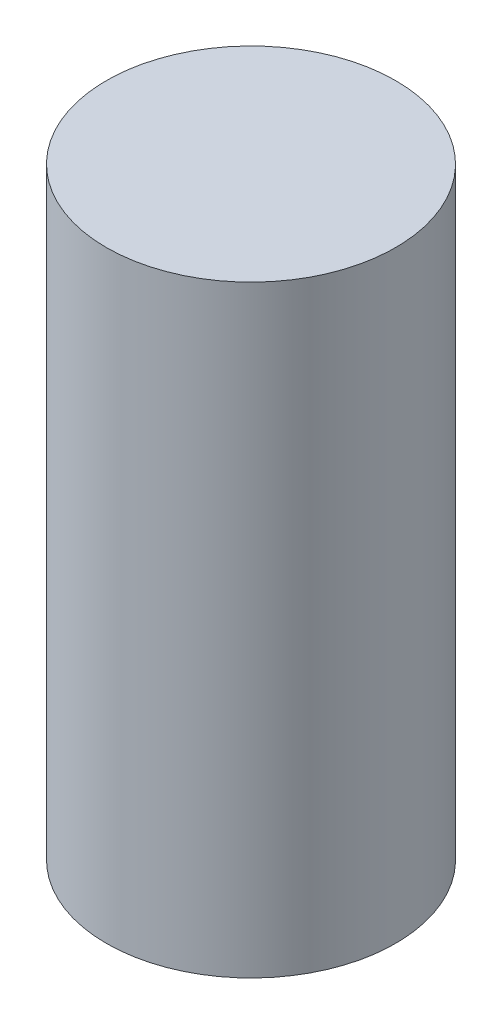
ISO-10303-21;
HEADER;
FILE_DESCRIPTION(('STEP AP214'),'2;1');
FILE_NAME('part.step','',(''),(''),'','','');
FILE_SCHEMA(('AUTOMOTIVE_DESIGN { 1 0 10303 214 1 1 1 1 }'));
ENDSEC;
DATA;
#1=APPLICATION_CONTEXT('core data for automotive mechanical design processes');
#2=APPLICATION_PROTOCOL_DEFINITION('international standard','automotive_design',2000,#1);
#3=PRODUCT_CONTEXT('',#1,'mechanical');
#4=PRODUCT('Part','Part','',(#3));
#5=PRODUCT_RELATED_PRODUCT_CATEGORY('part','',(#4));
#6=PRODUCT_DEFINITION_FORMATION('','',#4);
#7=PRODUCT_DEFINITION_CONTEXT('part definition',#1,'design');
#8=PRODUCT_DEFINITION('design','',#6,#7);
#9=PRODUCT_DEFINITION_SHAPE('','',#8);
#10=(LENGTH_UNIT() NAMED_UNIT(*) SI_UNIT(.MILLI.,.METRE.));
#11=(NAMED_UNIT(*) PLANE_ANGLE_UNIT() SI_UNIT($,.RADIAN.));
#12=(NAMED_UNIT(*) SI_UNIT($,.STERADIAN.) SOLID_ANGLE_UNIT());
#13=UNCERTAINTY_MEASURE_WITH_UNIT(LENGTH_MEASURE(1.E-05),#10,'distance_accuracy_value','');
#14=(GEOMETRIC_REPRESENTATION_CONTEXT(3) GLOBAL_UNCERTAINTY_ASSIGNED_CONTEXT((#13)) GLOBAL_UNIT_ASSIGNED_CONTEXT((#10,
#11,#12)) REPRESENTATION_CONTEXT('',''));
#15=CARTESIAN_POINT('',(0.,0.,0.));
#16=DIRECTION('',(0.,0.,1.));
#17=DIRECTION('',(1.,0.,0.));
#18=AXIS2_PLACEMENT_3D('',#15,#16,#17);
#19=CARTESIAN_POINT('',(0.,19.84375,0.));
#20=DIRECTION('',(0.,-1.,0.));
#21=DIRECTION('',(0.,0.,-1.));
#22=AXIS2_PLACEMENT_3D('',#19,#20,#21);
#23=CYLINDRICAL_SURFACE('',#22,4.7625);
#24=CARTESIAN_POINT('',(0.,19.84375,0.));
#25=DIRECTION('',(0.,1.,0.));
#26=DIRECTION('',(0.,0.,1.));
#27=AXIS2_PLACEMENT_3D('',#24,#25,#26);
#28=CIRCLE('',#27,4.7625);
#29=CARTESIAN_POINT('',(0.,19.84375,-4.7625));
#30=VERTEX_POINT('',#29);
#31=EDGE_CURVE('E10',#30,#30,#28,.T.);
#32=CARTESIAN_POINT('',(0.,0.,0.));
#33=DIRECTION('',(0.,1.,0.));
#34=DIRECTION('',(0.,0.,1.));
#35=AXIS2_PLACEMENT_3D('',#32,#33,#34);
#36=CIRCLE('',#35,4.7625);
#37=CARTESIAN_POINT('',(0.,0.,-4.7625));
#38=VERTEX_POINT('',#37);
#39=EDGE_CURVE('E37',#38,#38,#36,.T.);
#40=CARTESIAN_POINT('',(0.,19.84375,-4.7625));
#41=CARTESIAN_POINT('',(0.,19.6370442708333,-4.7625));
#42=CARTESIAN_POINT('',(0.,19.4303385416667,-4.7625));
#43=CARTESIAN_POINT('',(0.,19.0169270833333,-4.7625));
#44=CARTESIAN_POINT('',(0.,18.8102213541667,-4.7625));
#45=CARTESIAN_POINT('',(0.,18.3968098958333,-4.7625));
#46=CARTESIAN_POINT('',(0.,18.1901041666667,-4.7625));
#47=CARTESIAN_POINT('',(0.,17.7766927083333,-4.7625));
#48=CARTESIAN_POINT('',(0.,17.5699869791667,-4.7625));
#49=CARTESIAN_POINT('',(0.,17.1565755208333,-4.7625));
#50=CARTESIAN_POINT('',(0.,16.9498697916667,-4.7625));
#51=CARTESIAN_POINT('',(0.,16.5364583333333,-4.7625));
#52=CARTESIAN_POINT('',(0.,16.3297526041667,-4.7625));
#53=CARTESIAN_POINT('',(0.,15.9163411458333,-4.7625));
#54=CARTESIAN_POINT('',(0.,15.7096354166667,-4.7625));
#55=CARTESIAN_POINT('',(0.,15.2962239583333,-4.7625));
#56=CARTESIAN_POINT('',(0.,15.0895182291667,-4.7625));
#57=CARTESIAN_POINT('',(0.,14.6761067708333,-4.7625));
#58=CARTESIAN_POINT('',(0.,14.4694010416667,-4.7625));
#59=CARTESIAN_POINT('',(0.,14.0559895833333,-4.7625));
#60=CARTESIAN_POINT('',(0.,13.8492838541667,-4.7625));
#61=CARTESIAN_POINT('',(0.,13.4358723958333,-4.7625));
#62=CARTESIAN_POINT('',(0.,13.2291666666667,-4.7625));
#63=CARTESIAN_POINT('',(0.,12.8157552083333,-4.7625));
#64=CARTESIAN_POINT('',(0.,12.6090494791667,-4.7625));
#65=CARTESIAN_POINT('',(0.,12.1956380208333,-4.7625));
#66=CARTESIAN_POINT('',(0.,11.9889322916667,-4.7625));
#67=CARTESIAN_POINT('',(0.,11.5755208333333,-4.7625));
#68=CARTESIAN_POINT('',(0.,11.3688151041667,-4.7625));
#69=CARTESIAN_POINT('',(0.,10.9554036458333,-4.7625));
#70=CARTESIAN_POINT('',(0.,10.7486979166667,-4.7625));
#71=CARTESIAN_POINT('',(0.,10.3352864583333,-4.7625));
#72=CARTESIAN_POINT('',(0.,10.1285807291667,-4.7625));
#73=CARTESIAN_POINT('',(0.,9.71516927083333,-4.7625));
#74=CARTESIAN_POINT('',(0.,9.50846354166666,-4.7625));
#75=CARTESIAN_POINT('',(0.,9.09505208333333,-4.7625));
#76=CARTESIAN_POINT('',(0.,8.88834635416666,-4.7625));
#77=CARTESIAN_POINT('',(0.,8.47493489583333,-4.7625));
#78=CARTESIAN_POINT('',(0.,8.26822916666666,-4.7625));
#79=CARTESIAN_POINT('',(0.,7.85481770833333,-4.7625));
#80=CARTESIAN_POINT('',(0.,7.64811197916666,-4.7625));
#81=CARTESIAN_POINT('',(0.,7.23470052083333,-4.7625));
#82=CARTESIAN_POINT('',(0.,7.02799479166666,-4.7625));
#83=CARTESIAN_POINT('',(0.,6.61458333333333,-4.7625));
#84=CARTESIAN_POINT('',(0.,6.40787760416666,-4.7625));
#85=CARTESIAN_POINT('',(0.,5.99446614583333,-4.7625));
#86=CARTESIAN_POINT('',(0.,5.78776041666666,-4.7625));
#87=CARTESIAN_POINT('',(0.,5.37434895833333,-4.7625));
#88=CARTESIAN_POINT('',(0.,5.16764322916666,-4.7625));
#89=CARTESIAN_POINT('',(0.,4.75423177083333,-4.7625));
#90=CARTESIAN_POINT('',(0.,4.54752604166666,-4.7625));
#91=CARTESIAN_POINT('',(0.,4.13411458333333,-4.7625));
#92=CARTESIAN_POINT('',(0.,3.92740885416666,-4.7625));
#93=CARTESIAN_POINT('',(0.,3.51399739583333,-4.7625));
#94=CARTESIAN_POINT('',(0.,3.30729166666666,-4.7625));
#95=CARTESIAN_POINT('',(0.,2.89388020833333,-4.7625));
#96=CARTESIAN_POINT('',(0.,2.68717447916666,-4.7625));
#97=CARTESIAN_POINT('',(0.,2.27376302083333,-4.7625));
#98=CARTESIAN_POINT('',(0.,2.06705729166666,-4.7625));
#99=CARTESIAN_POINT('',(0.,1.65364583333333,-4.7625));
#100=CARTESIAN_POINT('',(0.,1.44694010416666,-4.7625));
#101=CARTESIAN_POINT('',(0.,1.03352864583333,-4.7625));
#102=CARTESIAN_POINT('',(0.,0.826822916666664,-4.7625));
#103=CARTESIAN_POINT('',(0.,0.413411458333331,-4.7625));
#104=CARTESIAN_POINT('',(0.,0.206705729166664,-4.7625));
#105=CARTESIAN_POINT('',(0.,0.,-4.7625));
#106=B_SPLINE_CURVE_WITH_KNOTS('',3,(#40,#41,#42,#43,#44,#45,#46,#47,#48,#49,#50,#51,#52,#53,
#54,#55,#56,#57,#58,#59,#60,#61,#62,#63,#64,#65,#66,#67,#68,#69,#70,#71,#72,#73,#74,#75,#76,#77,
#78,#79,#80,#81,#82,#83,#84,#85,#86,#87,#88,#89,#90,#91,#92,#93,#94,#95,#96,#97,#98,#99,#100,
#101,#102,#103,#104,#105),.UNSPECIFIED.,.F.,.F.,(4,2,2,2,2,2,2,2,2,2,2,2,2,2,2,2,2,2,2,2,2,2,2,
2,2,2,2,2,2,2,2,2,4),(0.,0.620117187500002,1.240234375,1.8603515625,2.48046875,3.1005859375,
3.720703125,4.3408203125,4.9609375,5.5810546875,6.201171875,6.8212890625,7.44140625,
8.0615234375,8.681640625,9.3017578125,9.921875,10.5419921875,11.162109375,11.7822265625,
12.40234375,13.0224609375,13.642578125,14.2626953125,14.8828125,15.5029296875,16.123046875,
16.7431640625,17.36328125,17.9833984375,18.603515625,19.2236328125,19.84375),.UNSPECIFIED.);
#107=EDGE_CURVE('BSEAM34',#30,#38,#106,.T.);
#108=ORIENTED_EDGE('',*,*,#31,.F.);
#109=ORIENTED_EDGE('',*,*,#39,.T.);
#110=ORIENTED_EDGE('',*,*,#107,.T.);
#111=ORIENTED_EDGE('',*,*,#107,.F.);
#112=EDGE_LOOP('',(#108,#110,#109,#111));
#113=FACE_BOUND('',#112,.T.);
#114=ADVANCED_FACE('F34',(#113),#23,.T.);
#115=CARTESIAN_POINT('',(0.,19.84375,0.));
#116=DIRECTION('',(0.,1.,0.));
#117=DIRECTION('',(0.,0.,1.));
#118=AXIS2_PLACEMENT_3D('',#115,#116,#117);
#119=PLANE('',#118);
#120=ORIENTED_EDGE('',*,*,#31,.T.);
#121=EDGE_LOOP('',(#120));
#122=FACE_BOUND('',#121,.T.);
#123=ADVANCED_FACE('F49',(#122),#119,.T.);
#124=CARTESIAN_POINT('',(0.,0.,0.));
#125=DIRECTION('',(0.,1.,0.));
#126=DIRECTION('',(0.,0.,1.));
#127=AXIS2_PLACEMENT_3D('',#124,#125,#126);
#128=PLANE('',#127);
#129=ORIENTED_EDGE('',*,*,#39,.F.);
#130=EDGE_LOOP('',(#129));
#131=FACE_BOUND('',#130,.T.);
#132=ADVANCED_FACE('F47',(#131),#128,.F.);
#133=CLOSED_SHELL('',(#114,#123,#132));
#134=MANIFOLD_SOLID_BREP('B2',#133);
#135=ADVANCED_BREP_SHAPE_REPRESENTATION('',(#18,#134),#14);
#136=SHAPE_DEFINITION_REPRESENTATION(#9,#135);
ENDSEC;
END-ISO-10303-21;
